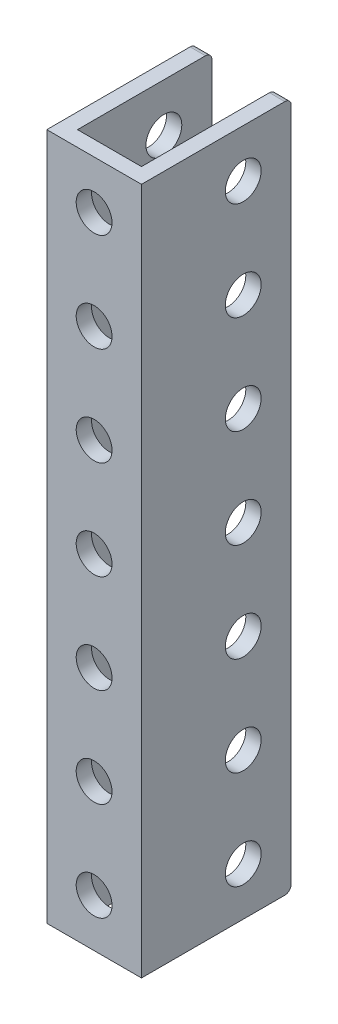
ISO-10303-21;
HEADER;
FILE_DESCRIPTION(('STEP AP214'),'2;1');
FILE_NAME('part.step','',(''),(''),'','','');
FILE_SCHEMA(('AUTOMOTIVE_DESIGN { 1 0 10303 214 1 1 1 1 }'));
ENDSEC;
DATA;
#1=APPLICATION_CONTEXT('core data for automotive mechanical design processes');
#2=APPLICATION_PROTOCOL_DEFINITION('international standard','automotive_design',2000,#1);
#3=PRODUCT_CONTEXT('',#1,'mechanical');
#4=PRODUCT('Part','Part','',(#3));
#5=PRODUCT_RELATED_PRODUCT_CATEGORY('part','',(#4));
#6=PRODUCT_DEFINITION_FORMATION('','',#4);
#7=PRODUCT_DEFINITION_CONTEXT('part definition',#1,'design');
#8=PRODUCT_DEFINITION('design','',#6,#7);
#9=PRODUCT_DEFINITION_SHAPE('','',#8);
#10=(LENGTH_UNIT() NAMED_UNIT(*) SI_UNIT(.MILLI.,.METRE.));
#11=(NAMED_UNIT(*) PLANE_ANGLE_UNIT() SI_UNIT($,.RADIAN.));
#12=(NAMED_UNIT(*) SI_UNIT($,.STERADIAN.) SOLID_ANGLE_UNIT());
#13=UNCERTAINTY_MEASURE_WITH_UNIT(LENGTH_MEASURE(1.E-05),#10,'distance_accuracy_value','');
#14=(GEOMETRIC_REPRESENTATION_CONTEXT(3) GLOBAL_UNCERTAINTY_ASSIGNED_CONTEXT((#13)) GLOBAL_UNIT_ASSIGNED_CONTEXT((#10,
#11,#12)) REPRESENTATION_CONTEXT('',''));
#15=CARTESIAN_POINT('',(0.,0.,0.));
#16=DIRECTION('',(0.,0.,1.));
#17=DIRECTION('',(1.,0.,0.));
#18=AXIS2_PLACEMENT_3D('',#15,#16,#17);
#19=CARTESIAN_POINT('',(4.699,0.,0.));
#20=DIRECTION('',(-1.,0.,0.));
#21=DIRECTION('',(0.,0.,1.));
#22=AXIS2_PLACEMENT_3D('',#19,#20,#21);
#23=PLANE('',#22);
#24=CARTESIAN_POINT('',(4.699,63.4365,-8.5725));
#25=DIRECTION('',(1.,0.,0.));
#26=DIRECTION('',(0.,0.,-1.));
#27=AXIS2_PLACEMENT_3D('',#24,#25,#26);
#28=CIRCLE('',#27,1.77799999999999);
#29=CARTESIAN_POINT('',(4.699,63.4365,-10.3505));
#30=VERTEX_POINT('',#29);
#31=EDGE_CURVE('E260',#30,#30,#28,.T.);
#32=ORIENTED_EDGE('',*,*,#31,.F.);
#33=EDGE_LOOP('',(#32));
#34=FACE_BOUND('',#33,.T.);
#35=CARTESIAN_POINT('',(4.699,34.0995,-8.5725));
#36=DIRECTION('',(1.,0.,0.));
#37=DIRECTION('',(0.,0.,-1.));
#38=AXIS2_PLACEMENT_3D('',#35,#36,#37);
#39=CIRCLE('',#38,1.77799999999998);
#40=CARTESIAN_POINT('',(4.699,34.0995,-10.3505));
#41=VERTEX_POINT('',#40);
#42=EDGE_CURVE('E248',#41,#41,#39,.T.);
#43=ORIENTED_EDGE('',*,*,#42,.F.);
#44=EDGE_LOOP('',(#43));
#45=FACE_BOUND('',#44,.T.);
#46=CARTESIAN_POINT('',(4.699,24.3205,-8.5725));
#47=DIRECTION('',(1.,0.,0.));
#48=DIRECTION('',(0.,0.,-1.));
#49=AXIS2_PLACEMENT_3D('',#46,#47,#48);
#50=CIRCLE('',#49,1.77799999999998);
#51=CARTESIAN_POINT('',(4.699,24.3205,-10.3505));
#52=VERTEX_POINT('',#51);
#53=EDGE_CURVE('E242',#52,#52,#50,.T.);
#54=ORIENTED_EDGE('',*,*,#53,.F.);
#55=EDGE_LOOP('',(#54));
#56=FACE_BOUND('',#55,.T.);
#57=CARTESIAN_POINT('',(4.699,14.5415,-8.5725));
#58=DIRECTION('',(1.,0.,0.));
#59=DIRECTION('',(0.,0.,-1.));
#60=AXIS2_PLACEMENT_3D('',#57,#58,#59);
#61=CIRCLE('',#60,1.77799999999998);
#62=CARTESIAN_POINT('',(4.699,14.5415,-10.3505));
#63=VERTEX_POINT('',#62);
#64=EDGE_CURVE('E236',#63,#63,#61,.T.);
#65=ORIENTED_EDGE('',*,*,#64,.F.);
#66=EDGE_LOOP('',(#65));
#67=FACE_BOUND('',#66,.T.);
#68=CARTESIAN_POINT('',(4.699,4.7625,-8.5725));
#69=DIRECTION('',(1.,0.,0.));
#70=DIRECTION('',(0.,0.,-1.));
#71=AXIS2_PLACEMENT_3D('',#68,#69,#70);
#72=CIRCLE('',#71,1.77799999999998);
#73=CARTESIAN_POINT('',(4.699,4.7625,-10.3505));
#74=VERTEX_POINT('',#73);
#75=EDGE_CURVE('E230',#74,#74,#72,.T.);
#76=ORIENTED_EDGE('',*,*,#75,.F.);
#77=EDGE_LOOP('',(#76));
#78=FACE_BOUND('',#77,.T.);
#79=DIRECTION('',(0.,0.,1.));
#80=VECTOR('',#79,1.);
#81=CARTESIAN_POINT('',(4.69899999999999,0.,-13.335));
#82=LINE('',#81,#80);
#83=CARTESIAN_POINT('',(4.69899999999999,0.,-12.7));
#84=VERTEX_POINT('',#83);
#85=CARTESIAN_POINT('',(4.699,0.,1.524));
#86=VERTEX_POINT('',#85);
#87=EDGE_CURVE('E169',#84,#86,#82,.T.);
#88=ORIENTED_EDGE('',*,*,#87,.F.);
#89=CARTESIAN_POINT('',(4.699,0.634999999999997,-12.7));
#90=DIRECTION('',(-1.,0.,0.));
#91=DIRECTION('',(0.,0.,1.));
#92=AXIS2_PLACEMENT_3D('',#89,#90,#91);
#93=CIRCLE('',#92,0.635);
#94=CARTESIAN_POINT('',(4.69899999999999,0.634999999999997,-13.335));
#95=VERTEX_POINT('',#94);
#96=EDGE_CURVE('E203',#84,#95,#93,.F.);
#97=ORIENTED_EDGE('',*,*,#96,.T.);
#98=DIRECTION('',(0.,-1.,0.));
#99=VECTOR('',#98,1.);
#100=CARTESIAN_POINT('',(4.69899999999999,68.199,-13.335));
#101=LINE('',#100,#99);
#102=CARTESIAN_POINT('',(4.69899999999999,67.564,-13.335));
#103=VERTEX_POINT('',#102);
#104=EDGE_CURVE('E165',#103,#95,#101,.T.);
#105=ORIENTED_EDGE('',*,*,#104,.F.);
#106=CARTESIAN_POINT('',(4.699,67.564,-12.7));
#107=DIRECTION('',(-1.,0.,0.));
#108=DIRECTION('',(0.,0.,1.));
#109=AXIS2_PLACEMENT_3D('',#106,#107,#108);
#110=CIRCLE('',#109,0.635);
#111=CARTESIAN_POINT('',(4.69899999999999,68.199,-12.7));
#112=VERTEX_POINT('',#111);
#113=EDGE_CURVE('E201',#103,#112,#110,.F.);
#114=ORIENTED_EDGE('',*,*,#113,.T.);
#115=DIRECTION('',(0.,0.,-1.));
#116=VECTOR('',#115,1.);
#117=CARTESIAN_POINT('',(4.699,68.199,1.524));
#118=LINE('',#117,#116);
#119=CARTESIAN_POINT('',(4.699,68.199,1.524));
#120=VERTEX_POINT('',#119);
#121=EDGE_CURVE('E163',#120,#112,#118,.T.);
#122=ORIENTED_EDGE('',*,*,#121,.F.);
#123=DIRECTION('',(0.,1.,0.));
#124=VECTOR('',#123,1.);
#125=CARTESIAN_POINT('',(4.699,0.,1.524));
#126=LINE('',#125,#124);
#127=EDGE_CURVE('E171',#86,#120,#126,.T.);
#128=ORIENTED_EDGE('',*,*,#127,.F.);
#129=EDGE_LOOP('',(#88,#97,#105,#114,#122,#128));
#130=FACE_BOUND('',#129,.T.);
#131=CARTESIAN_POINT('',(4.699,43.8785,-8.5725));
#132=DIRECTION('',(1.,0.,0.));
#133=DIRECTION('',(0.,0.,-1.));
#134=AXIS2_PLACEMENT_3D('',#131,#132,#133);
#135=CIRCLE('',#134,1.77799999999998);
#136=CARTESIAN_POINT('',(4.699,43.8785,-10.3505));
#137=VERTEX_POINT('',#136);
#138=EDGE_CURVE('E254',#137,#137,#135,.T.);
#139=ORIENTED_EDGE('',*,*,#138,.F.);
#140=EDGE_LOOP('',(#139));
#141=FACE_BOUND('',#140,.T.);
#142=CARTESIAN_POINT('',(4.699,53.6575,-8.5725));
#143=DIRECTION('',(1.,0.,0.));
#144=DIRECTION('',(0.,0.,-1.));
#145=AXIS2_PLACEMENT_3D('',#142,#143,#144);
#146=CIRCLE('',#145,1.77799999999998);
#147=CARTESIAN_POINT('',(4.699,53.6575,-10.3505));
#148=VERTEX_POINT('',#147);
#149=EDGE_CURVE('E266',#148,#148,#146,.T.);
#150=ORIENTED_EDGE('',*,*,#149,.F.);
#151=EDGE_LOOP('',(#150));
#152=FACE_BOUND('',#151,.T.);
#153=ADVANCED_FACE('F33',(#34,#45,#56,#67,#78,#130,#141,#152),#23,.F.);
#154=CARTESIAN_POINT('',(4.69899999999999,68.199,-13.335));
#155=DIRECTION('',(0.,0.,-1.));
#156=DIRECTION('',(-1.,0.,0.));
#157=AXIS2_PLACEMENT_3D('',#154,#155,#156);
#158=PLANE('',#157);
#159=DIRECTION('',(0.,-1.,0.));
#160=VECTOR('',#159,1.);
#161=CARTESIAN_POINT('',(-4.699,68.199,-13.335));
#162=LINE('',#161,#160);
#163=CARTESIAN_POINT('',(-4.699,67.564,-13.335));
#164=VERTEX_POINT('',#163);
#165=CARTESIAN_POINT('',(-4.699,0.634999999999997,-13.335));
#166=VERTEX_POINT('',#165);
#167=EDGE_CURVE('E177',#164,#166,#162,.T.);
#168=ORIENTED_EDGE('',*,*,#167,.F.);
#169=DIRECTION('',(-1.,0.,0.));
#170=VECTOR('',#169,1.);
#171=CARTESIAN_POINT('',(4.69899999999999,67.564,-13.335));
#172=LINE('',#171,#170);
#173=CARTESIAN_POINT('',(-3.175,67.564,-13.335));
#174=VERTEX_POINT('',#173);
#175=EDGE_CURVE('E54',#164,#174,#172,.F.);
#176=ORIENTED_EDGE('',*,*,#175,.T.);
#177=DIRECTION('',(0.,-1.,0.));
#178=VECTOR('',#177,1.);
#179=CARTESIAN_POINT('',(-3.175,68.199,-13.335));
#180=LINE('',#179,#178);
#181=CARTESIAN_POINT('',(-3.175,0.634999999999997,-13.335));
#182=VERTEX_POINT('',#181);
#183=EDGE_CURVE('E149',#174,#182,#180,.T.);
#184=ORIENTED_EDGE('',*,*,#183,.T.);
#185=DIRECTION('',(-1.,0.,0.));
#186=VECTOR('',#185,1.);
#187=CARTESIAN_POINT('',(4.69899999999999,0.634999999999997,-13.335));
#188=LINE('',#187,#186);
#189=EDGE_CURVE('E213',#182,#166,#188,.T.);
#190=ORIENTED_EDGE('',*,*,#189,.T.);
#191=EDGE_LOOP('',(#168,#176,#184,#190));
#192=FACE_BOUND('',#191,.T.);
#193=ADVANCED_FACE('F217',(#192),#158,.T.);
#194=CARTESIAN_POINT('',(4.699,68.199,1.524));
#195=DIRECTION('',(0.,1.,0.));
#196=DIRECTION('',(0.,0.,1.));
#197=AXIS2_PLACEMENT_3D('',#194,#195,#196);
#198=PLANE('',#197);
#199=ORIENTED_EDGE('',*,*,#121,.T.);
#200=DIRECTION('',(-1.,0.,0.));
#201=VECTOR('',#200,1.);
#202=CARTESIAN_POINT('',(4.69899999999999,68.199,-12.7));
#203=LINE('',#202,#201);
#204=CARTESIAN_POINT('',(3.175,68.199,-12.7));
#205=VERTEX_POINT('',#204);
#206=EDGE_CURVE('E131',#112,#205,#203,.T.);
#207=ORIENTED_EDGE('',*,*,#206,.T.);
#208=DIRECTION('',(0.,0.,1.));
#209=VECTOR('',#208,1.);
#210=CARTESIAN_POINT('',(3.175,68.199,-13.335));
#211=LINE('',#210,#209);
#212=CARTESIAN_POINT('',(3.175,68.199,0.));
#213=VERTEX_POINT('',#212);
#214=EDGE_CURVE('E123',#205,#213,#211,.T.);
#215=ORIENTED_EDGE('',*,*,#214,.T.);
#216=DIRECTION('',(-1.,0.,0.));
#217=VECTOR('',#216,1.);
#218=CARTESIAN_POINT('',(3.175,68.199,0.));
#219=LINE('',#218,#217);
#220=CARTESIAN_POINT('',(-3.175,68.199,0.));
#221=VERTEX_POINT('',#220);
#222=EDGE_CURVE('E129',#213,#221,#219,.T.);
#223=ORIENTED_EDGE('',*,*,#222,.T.);
#224=DIRECTION('',(0.,0.,-1.));
#225=VECTOR('',#224,1.);
#226=CARTESIAN_POINT('',(-3.175,68.199,0.));
#227=LINE('',#226,#225);
#228=CARTESIAN_POINT('',(-3.175,68.199,-12.7));
#229=VERTEX_POINT('',#228);
#230=EDGE_CURVE('E133',#221,#229,#227,.T.);
#231=ORIENTED_EDGE('',*,*,#230,.T.);
#232=DIRECTION('',(-1.,0.,0.));
#233=VECTOR('',#232,1.);
#234=CARTESIAN_POINT('',(4.69899999999999,68.199,-12.7));
#235=LINE('',#234,#233);
#236=CARTESIAN_POINT('',(-4.699,68.199,-12.7));
#237=VERTEX_POINT('',#236);
#238=EDGE_CURVE('E205',#229,#237,#235,.T.);
#239=ORIENTED_EDGE('',*,*,#238,.T.);
#240=DIRECTION('',(0.,0.,-1.));
#241=VECTOR('',#240,1.);
#242=CARTESIAN_POINT('',(-4.699,68.199,1.524));
#243=LINE('',#242,#241);
#244=CARTESIAN_POINT('',(-4.699,68.199,1.524));
#245=VERTEX_POINT('',#244);
#246=EDGE_CURVE('E160',#245,#237,#243,.T.);
#247=ORIENTED_EDGE('',*,*,#246,.F.);
#248=DIRECTION('',(-1.,0.,0.));
#249=VECTOR('',#248,1.);
#250=CARTESIAN_POINT('',(4.699,68.199,1.524));
#251=LINE('',#250,#249);
#252=EDGE_CURVE('E184',#120,#245,#251,.T.);
#253=ORIENTED_EDGE('',*,*,#252,.F.);
#254=EDGE_LOOP('',(#199,#207,#215,#223,#231,#239,#247,#253));
#255=FACE_BOUND('',#254,.T.);
#256=ADVANCED_FACE('F126',(#255),#198,.T.);
#257=CARTESIAN_POINT('',(4.699,0.,1.524));
#258=DIRECTION('',(0.,0.,1.));
#259=DIRECTION('',(1.,0.,0.));
#260=AXIS2_PLACEMENT_3D('',#257,#258,#259);
#261=PLANE('',#260);
#262=CARTESIAN_POINT('',(0.,53.6575,1.524));
#263=DIRECTION('',(0.,0.,1.));
#264=DIRECTION('',(1.,0.,0.));
#265=AXIS2_PLACEMENT_3D('',#262,#263,#264);
#266=CIRCLE('',#265,1.77799999999998);
#267=CARTESIAN_POINT('',(1.77799999999998,53.6575,1.524));
#268=VERTEX_POINT('',#267);
#269=EDGE_CURVE('E308',#268,#268,#266,.T.);
#270=ORIENTED_EDGE('',*,*,#269,.F.);
#271=EDGE_LOOP('',(#270));
#272=FACE_BOUND('',#271,.T.);
#273=CARTESIAN_POINT('',(0.,63.4365,1.524));
#274=DIRECTION('',(0.,0.,1.));
#275=DIRECTION('',(1.,0.,0.));
#276=AXIS2_PLACEMENT_3D('',#273,#274,#275);
#277=CIRCLE('',#276,1.77799999999998);
#278=CARTESIAN_POINT('',(1.77799999999998,63.4365,1.524));
#279=VERTEX_POINT('',#278);
#280=EDGE_CURVE('E302',#279,#279,#277,.T.);
#281=ORIENTED_EDGE('',*,*,#280,.F.);
#282=EDGE_LOOP('',(#281));
#283=FACE_BOUND('',#282,.T.);
#284=CARTESIAN_POINT('',(0.,43.8785,1.524));
#285=DIRECTION('',(0.,0.,1.));
#286=DIRECTION('',(1.,0.,0.));
#287=AXIS2_PLACEMENT_3D('',#284,#285,#286);
#288=CIRCLE('',#287,1.77799999999998);
#289=CARTESIAN_POINT('',(1.77799999999998,43.8785,1.524));
#290=VERTEX_POINT('',#289);
#291=EDGE_CURVE('E296',#290,#290,#288,.T.);
#292=ORIENTED_EDGE('',*,*,#291,.F.);
#293=EDGE_LOOP('',(#292));
#294=FACE_BOUND('',#293,.T.);
#295=CARTESIAN_POINT('',(0.,34.0995,1.524));
#296=DIRECTION('',(0.,0.,1.));
#297=DIRECTION('',(1.,0.,0.));
#298=AXIS2_PLACEMENT_3D('',#295,#296,#297);
#299=CIRCLE('',#298,1.77799999999998);
#300=CARTESIAN_POINT('',(1.77799999999998,34.0995,1.524));
#301=VERTEX_POINT('',#300);
#302=EDGE_CURVE('E290',#301,#301,#299,.T.);
#303=ORIENTED_EDGE('',*,*,#302,.F.);
#304=EDGE_LOOP('',(#303));
#305=FACE_BOUND('',#304,.T.);
#306=CARTESIAN_POINT('',(0.,24.3205,1.524));
#307=DIRECTION('',(0.,0.,1.));
#308=DIRECTION('',(1.,0.,0.));
#309=AXIS2_PLACEMENT_3D('',#306,#307,#308);
#310=CIRCLE('',#309,1.77799999999998);
#311=CARTESIAN_POINT('',(1.77799999999998,24.3205,1.524));
#312=VERTEX_POINT('',#311);
#313=EDGE_CURVE('E284',#312,#312,#310,.T.);
#314=ORIENTED_EDGE('',*,*,#313,.F.);
#315=EDGE_LOOP('',(#314));
#316=FACE_BOUND('',#315,.T.);
#317=CARTESIAN_POINT('',(0.,14.5415,1.524));
#318=DIRECTION('',(0.,0.,1.));
#319=DIRECTION('',(1.,0.,0.));
#320=AXIS2_PLACEMENT_3D('',#317,#318,#319);
#321=CIRCLE('',#320,1.77799999999998);
#322=CARTESIAN_POINT('',(1.77799999999998,14.5415,1.524));
#323=VERTEX_POINT('',#322);
#324=EDGE_CURVE('E278',#323,#323,#321,.T.);
#325=ORIENTED_EDGE('',*,*,#324,.F.);
#326=EDGE_LOOP('',(#325));
#327=FACE_BOUND('',#326,.T.);
#328=CARTESIAN_POINT('',(0.,4.7625,1.524));
#329=DIRECTION('',(0.,0.,1.));
#330=DIRECTION('',(1.,0.,0.));
#331=AXIS2_PLACEMENT_3D('',#328,#329,#330);
#332=CIRCLE('',#331,1.77799999999998);
#333=CARTESIAN_POINT('',(1.77799999999998,4.7625,1.524));
#334=VERTEX_POINT('',#333);
#335=EDGE_CURVE('E272',#334,#334,#332,.T.);
#336=ORIENTED_EDGE('',*,*,#335,.F.);
#337=EDGE_LOOP('',(#336));
#338=FACE_BOUND('',#337,.T.);
#339=DIRECTION('',(0.,1.,0.));
#340=VECTOR('',#339,1.);
#341=CARTESIAN_POINT('',(-4.699,0.,1.524));
#342=LINE('',#341,#340);
#343=CARTESIAN_POINT('',(-4.699,0.,1.524));
#344=VERTEX_POINT('',#343);
#345=EDGE_CURVE('E166',#344,#245,#342,.T.);
#346=ORIENTED_EDGE('',*,*,#345,.F.);
#347=DIRECTION('',(-1.,0.,0.));
#348=VECTOR('',#347,1.);
#349=CARTESIAN_POINT('',(4.699,0.,1.524));
#350=LINE('',#349,#348);
#351=EDGE_CURVE('E174',#86,#344,#350,.T.);
#352=ORIENTED_EDGE('',*,*,#351,.F.);
#353=ORIENTED_EDGE('',*,*,#127,.T.);
#354=ORIENTED_EDGE('',*,*,#252,.T.);
#355=EDGE_LOOP('',(#346,#352,#353,#354));
#356=FACE_BOUND('',#355,.T.);
#357=ADVANCED_FACE('F404',(#272,#283,#294,#305,#316,#327,#338,#356),#261,.T.);
#358=CARTESIAN_POINT('',(4.69899999999999,0.,-13.335));
#359=DIRECTION('',(0.,-1.,0.));
#360=DIRECTION('',(0.,0.,-1.));
#361=AXIS2_PLACEMENT_3D('',#358,#359,#360);
#362=PLANE('',#361);
#363=DIRECTION('',(0.,0.,1.));
#364=VECTOR('',#363,1.);
#365=CARTESIAN_POINT('',(3.175,0.,-13.335));
#366=LINE('',#365,#364);
#367=CARTESIAN_POINT('',(3.175,0.,-12.7));
#368=VERTEX_POINT('',#367);
#369=CARTESIAN_POINT('',(3.175,0.,0.));
#370=VERTEX_POINT('',#369);
#371=EDGE_CURVE('E140',#368,#370,#366,.T.);
#372=ORIENTED_EDGE('',*,*,#371,.F.);
#373=DIRECTION('',(-1.,0.,0.));
#374=VECTOR('',#373,1.);
#375=CARTESIAN_POINT('',(4.69899999999999,0.,-12.7));
#376=LINE('',#375,#374);
#377=EDGE_CURVE('E199',#368,#84,#376,.F.);
#378=ORIENTED_EDGE('',*,*,#377,.T.);
#379=ORIENTED_EDGE('',*,*,#87,.T.);
#380=ORIENTED_EDGE('',*,*,#351,.T.);
#381=DIRECTION('',(0.,0.,1.));
#382=VECTOR('',#381,1.);
#383=CARTESIAN_POINT('',(-4.699,0.,-13.335));
#384=LINE('',#383,#382);
#385=CARTESIAN_POINT('',(-4.699,0.,-12.7));
#386=VERTEX_POINT('',#385);
#387=EDGE_CURVE('E180',#386,#344,#384,.T.);
#388=ORIENTED_EDGE('',*,*,#387,.F.);
#389=DIRECTION('',(-1.,0.,0.));
#390=VECTOR('',#389,1.);
#391=CARTESIAN_POINT('',(4.69899999999999,0.,-12.7));
#392=LINE('',#391,#390);
#393=CARTESIAN_POINT('',(-3.175,0.,-12.7));
#394=VERTEX_POINT('',#393);
#395=EDGE_CURVE('E197',#386,#394,#392,.F.);
#396=ORIENTED_EDGE('',*,*,#395,.T.);
#397=DIRECTION('',(0.,0.,-1.));
#398=VECTOR('',#397,1.);
#399=CARTESIAN_POINT('',(-3.175,0.,0.));
#400=LINE('',#399,#398);
#401=CARTESIAN_POINT('',(-3.175,0.,0.));
#402=VERTEX_POINT('',#401);
#403=EDGE_CURVE('E154',#402,#394,#400,.T.);
#404=ORIENTED_EDGE('',*,*,#403,.F.);
#405=DIRECTION('',(-1.,0.,0.));
#406=VECTOR('',#405,1.);
#407=CARTESIAN_POINT('',(3.175,0.,0.));
#408=LINE('',#407,#406);
#409=EDGE_CURVE('E158',#370,#402,#408,.T.);
#410=ORIENTED_EDGE('',*,*,#409,.F.);
#411=EDGE_LOOP('',(#372,#378,#379,#380,#388,#396,#404,#410));
#412=FACE_BOUND('',#411,.T.);
#413=ADVANCED_FACE('F407',(#412),#362,.T.);
#414=ORIENTED_EDGE('',*,*,#104,.T.);
#415=DIRECTION('',(-1.,0.,0.));
#416=VECTOR('',#415,1.);
#417=CARTESIAN_POINT('',(4.69899999999999,0.634999999999997,-13.335));
#418=LINE('',#417,#416);
#419=CARTESIAN_POINT('',(3.175,0.634999999999997,-13.335));
#420=VERTEX_POINT('',#419);
#421=EDGE_CURVE('E190',#95,#420,#418,.T.);
#422=ORIENTED_EDGE('',*,*,#421,.T.);
#423=DIRECTION('',(0.,-1.,0.));
#424=VECTOR('',#423,1.);
#425=CARTESIAN_POINT('',(3.175,68.199,-13.335));
#426=LINE('',#425,#424);
#427=CARTESIAN_POINT('',(3.175,67.564,-13.335));
#428=VERTEX_POINT('',#427);
#429=EDGE_CURVE('E145',#428,#420,#426,.T.);
#430=ORIENTED_EDGE('',*,*,#429,.F.);
#431=DIRECTION('',(-1.,0.,0.));
#432=VECTOR('',#431,1.);
#433=CARTESIAN_POINT('',(4.69899999999999,67.564,-13.335));
#434=LINE('',#433,#432);
#435=EDGE_CURVE('E186',#428,#103,#434,.F.);
#436=ORIENTED_EDGE('',*,*,#435,.T.);
#437=EDGE_LOOP('',(#414,#422,#430,#436));
#438=FACE_BOUND('',#437,.T.);
#439=ADVANCED_FACE('F396',(#438),#158,.T.);
#440=CARTESIAN_POINT('',(-4.699,0.,0.));
#441=DIRECTION('',(-1.,0.,0.));
#442=DIRECTION('',(0.,0.,1.));
#443=AXIS2_PLACEMENT_3D('',#440,#441,#442);
#444=PLANE('',#443);
#445=CARTESIAN_POINT('',(-4.69900000000001,53.6575,-8.5725));
#446=DIRECTION('',(1.,0.,0.));
#447=DIRECTION('',(0.,0.,-1.));
#448=AXIS2_PLACEMENT_3D('',#445,#446,#447);
#449=CIRCLE('',#448,1.77799999999998);
#450=CARTESIAN_POINT('',(-4.69900000000001,53.6575,-10.3505));
#451=VERTEX_POINT('',#450);
#452=EDGE_CURVE('E347',#451,#451,#449,.T.);
#453=ORIENTED_EDGE('',*,*,#452,.T.);
#454=EDGE_LOOP('',(#453));
#455=FACE_BOUND('',#454,.T.);
#456=CARTESIAN_POINT('',(-4.69900000000001,63.4365,-8.5725));
#457=DIRECTION('',(1.,0.,0.));
#458=DIRECTION('',(0.,0.,-1.));
#459=AXIS2_PLACEMENT_3D('',#456,#457,#458);
#460=CIRCLE('',#459,1.77799999999999);
#461=CARTESIAN_POINT('',(-4.69900000000001,63.4365,-10.3505));
#462=VERTEX_POINT('',#461);
#463=EDGE_CURVE('E341',#462,#462,#460,.T.);
#464=ORIENTED_EDGE('',*,*,#463,.T.);
#465=EDGE_LOOP('',(#464));
#466=FACE_BOUND('',#465,.T.);
#467=CARTESIAN_POINT('',(-4.69900000000001,43.8785,-8.5725));
#468=DIRECTION('',(1.,0.,0.));
#469=DIRECTION('',(0.,0.,-1.));
#470=AXIS2_PLACEMENT_3D('',#467,#468,#469);
#471=CIRCLE('',#470,1.77799999999998);
#472=CARTESIAN_POINT('',(-4.69900000000001,43.8785,-10.3505));
#473=VERTEX_POINT('',#472);
#474=EDGE_CURVE('E335',#473,#473,#471,.T.);
#475=ORIENTED_EDGE('',*,*,#474,.T.);
#476=EDGE_LOOP('',(#475));
#477=FACE_BOUND('',#476,.T.);
#478=CARTESIAN_POINT('',(-4.69900000000001,34.0995,-8.5725));
#479=DIRECTION('',(1.,0.,0.));
#480=DIRECTION('',(0.,0.,-1.));
#481=AXIS2_PLACEMENT_3D('',#478,#479,#480);
#482=CIRCLE('',#481,1.77799999999998);
#483=CARTESIAN_POINT('',(-4.69900000000001,34.0995,-10.3505));
#484=VERTEX_POINT('',#483);
#485=EDGE_CURVE('E329',#484,#484,#482,.T.);
#486=ORIENTED_EDGE('',*,*,#485,.T.);
#487=EDGE_LOOP('',(#486));
#488=FACE_BOUND('',#487,.T.);
#489=CARTESIAN_POINT('',(-4.69900000000001,24.3205,-8.5725));
#490=DIRECTION('',(1.,0.,0.));
#491=DIRECTION('',(0.,0.,-1.));
#492=AXIS2_PLACEMENT_3D('',#489,#490,#491);
#493=CIRCLE('',#492,1.77799999999998);
#494=CARTESIAN_POINT('',(-4.69900000000001,24.3205,-10.3505));
#495=VERTEX_POINT('',#494);
#496=EDGE_CURVE('E323',#495,#495,#493,.T.);
#497=ORIENTED_EDGE('',*,*,#496,.T.);
#498=EDGE_LOOP('',(#497));
#499=FACE_BOUND('',#498,.T.);
#500=CARTESIAN_POINT('',(-4.69900000000001,14.5415,-8.5725));
#501=DIRECTION('',(1.,0.,0.));
#502=DIRECTION('',(0.,0.,-1.));
#503=AXIS2_PLACEMENT_3D('',#500,#501,#502);
#504=CIRCLE('',#503,1.77799999999998);
#505=CARTESIAN_POINT('',(-4.69900000000001,14.5415,-10.3505));
#506=VERTEX_POINT('',#505);
#507=EDGE_CURVE('E317',#506,#506,#504,.T.);
#508=ORIENTED_EDGE('',*,*,#507,.T.);
#509=EDGE_LOOP('',(#508));
#510=FACE_BOUND('',#509,.T.);
#511=CARTESIAN_POINT('',(-4.69900000000001,4.7625,-8.5725));
#512=DIRECTION('',(1.,0.,0.));
#513=DIRECTION('',(0.,0.,-1.));
#514=AXIS2_PLACEMENT_3D('',#511,#512,#513);
#515=CIRCLE('',#514,1.77799999999998);
#516=CARTESIAN_POINT('',(-4.69900000000001,4.7625,-10.3505));
#517=VERTEX_POINT('',#516);
#518=EDGE_CURVE('E311',#517,#517,#515,.T.);
#519=ORIENTED_EDGE('',*,*,#518,.T.);
#520=EDGE_LOOP('',(#519));
#521=FACE_BOUND('',#520,.T.);
#522=ORIENTED_EDGE('',*,*,#246,.T.);
#523=CARTESIAN_POINT('',(-4.699,67.564,-12.7));
#524=DIRECTION('',(-1.,0.,0.));
#525=DIRECTION('',(0.,0.,1.));
#526=AXIS2_PLACEMENT_3D('',#523,#524,#525);
#527=CIRCLE('',#526,0.635);
#528=EDGE_CURVE('E211',#237,#164,#527,.T.);
#529=ORIENTED_EDGE('',*,*,#528,.T.);
#530=ORIENTED_EDGE('',*,*,#167,.T.);
#531=CARTESIAN_POINT('',(-4.699,0.634999999999997,-12.7));
#532=DIRECTION('',(-1.,0.,0.));
#533=DIRECTION('',(0.,0.,1.));
#534=AXIS2_PLACEMENT_3D('',#531,#532,#533);
#535=CIRCLE('',#534,0.635);
#536=EDGE_CURVE('E209',#166,#386,#535,.T.);
#537=ORIENTED_EDGE('',*,*,#536,.T.);
#538=ORIENTED_EDGE('',*,*,#387,.T.);
#539=ORIENTED_EDGE('',*,*,#345,.T.);
#540=EDGE_LOOP('',(#522,#529,#530,#537,#538,#539));
#541=FACE_BOUND('',#540,.T.);
#542=ADVANCED_FACE('F220',(#455,#466,#477,#488,#499,#510,#521,#541),#444,.T.);
#543=CARTESIAN_POINT('',(-3.175,68.199,0.));
#544=DIRECTION('',(-1.,0.,0.));
#545=DIRECTION('',(0.,0.,1.));
#546=AXIS2_PLACEMENT_3D('',#543,#544,#545);
#547=PLANE('',#546);
#548=CARTESIAN_POINT('',(-3.175,53.6575,-8.5725));
#549=DIRECTION('',(1.,0.,0.));
#550=DIRECTION('',(0.,0.,-1.));
#551=AXIS2_PLACEMENT_3D('',#548,#549,#550);
#552=CIRCLE('',#551,1.77799999999998);
#553=CARTESIAN_POINT('',(-3.175,53.6575,-10.3505));
#554=VERTEX_POINT('',#553);
#555=EDGE_CURVE('E350',#554,#554,#552,.T.);
#556=ORIENTED_EDGE('',*,*,#555,.F.);
#557=EDGE_LOOP('',(#556));
#558=FACE_BOUND('',#557,.T.);
#559=CARTESIAN_POINT('',(-3.175,63.4365,-8.5725));
#560=DIRECTION('',(1.,0.,0.));
#561=DIRECTION('',(0.,0.,-1.));
#562=AXIS2_PLACEMENT_3D('',#559,#560,#561);
#563=CIRCLE('',#562,1.77799999999999);
#564=CARTESIAN_POINT('',(-3.175,63.4365,-10.3505));
#565=VERTEX_POINT('',#564);
#566=EDGE_CURVE('E344',#565,#565,#563,.T.);
#567=ORIENTED_EDGE('',*,*,#566,.F.);
#568=EDGE_LOOP('',(#567));
#569=FACE_BOUND('',#568,.T.);
#570=CARTESIAN_POINT('',(-3.175,43.8785,-8.5725));
#571=DIRECTION('',(1.,0.,0.));
#572=DIRECTION('',(0.,0.,-1.));
#573=AXIS2_PLACEMENT_3D('',#570,#571,#572);
#574=CIRCLE('',#573,1.77799999999998);
#575=CARTESIAN_POINT('',(-3.175,43.8785,-10.3505));
#576=VERTEX_POINT('',#575);
#577=EDGE_CURVE('E338',#576,#576,#574,.T.);
#578=ORIENTED_EDGE('',*,*,#577,.F.);
#579=EDGE_LOOP('',(#578));
#580=FACE_BOUND('',#579,.T.);
#581=CARTESIAN_POINT('',(-3.175,34.0995,-8.5725));
#582=DIRECTION('',(1.,0.,0.));
#583=DIRECTION('',(0.,0.,-1.));
#584=AXIS2_PLACEMENT_3D('',#581,#582,#583);
#585=CIRCLE('',#584,1.77799999999998);
#586=CARTESIAN_POINT('',(-3.175,34.0995,-10.3505));
#587=VERTEX_POINT('',#586);
#588=EDGE_CURVE('E332',#587,#587,#585,.T.);
#589=ORIENTED_EDGE('',*,*,#588,.F.);
#590=EDGE_LOOP('',(#589));
#591=FACE_BOUND('',#590,.T.);
#592=CARTESIAN_POINT('',(-3.175,24.3205,-8.5725));
#593=DIRECTION('',(1.,0.,0.));
#594=DIRECTION('',(0.,0.,-1.));
#595=AXIS2_PLACEMENT_3D('',#592,#593,#594);
#596=CIRCLE('',#595,1.77799999999998);
#597=CARTESIAN_POINT('',(-3.175,24.3205,-10.3505));
#598=VERTEX_POINT('',#597);
#599=EDGE_CURVE('E326',#598,#598,#596,.T.);
#600=ORIENTED_EDGE('',*,*,#599,.F.);
#601=EDGE_LOOP('',(#600));
#602=FACE_BOUND('',#601,.T.);
#603=CARTESIAN_POINT('',(-3.175,14.5415,-8.5725));
#604=DIRECTION('',(1.,0.,0.));
#605=DIRECTION('',(0.,0.,-1.));
#606=AXIS2_PLACEMENT_3D('',#603,#604,#605);
#607=CIRCLE('',#606,1.77799999999998);
#608=CARTESIAN_POINT('',(-3.175,14.5415,-10.3505));
#609=VERTEX_POINT('',#608);
#610=EDGE_CURVE('E320',#609,#609,#607,.T.);
#611=ORIENTED_EDGE('',*,*,#610,.F.);
#612=EDGE_LOOP('',(#611));
#613=FACE_BOUND('',#612,.T.);
#614=CARTESIAN_POINT('',(-3.175,4.7625,-8.5725));
#615=DIRECTION('',(1.,0.,0.));
#616=DIRECTION('',(0.,0.,-1.));
#617=AXIS2_PLACEMENT_3D('',#614,#615,#616);
#618=CIRCLE('',#617,1.77799999999998);
#619=CARTESIAN_POINT('',(-3.175,4.7625,-10.3505));
#620=VERTEX_POINT('',#619);
#621=EDGE_CURVE('E314',#620,#620,#618,.T.);
#622=ORIENTED_EDGE('',*,*,#621,.F.);
#623=EDGE_LOOP('',(#622));
#624=FACE_BOUND('',#623,.T.);
#625=ORIENTED_EDGE('',*,*,#183,.F.);
#626=CARTESIAN_POINT('',(-3.175,67.564,-12.7));
#627=DIRECTION('',(-1.,0.,0.));
#628=DIRECTION('',(0.,0.,1.));
#629=AXIS2_PLACEMENT_3D('',#626,#627,#628);
#630=CIRCLE('',#629,0.635);
#631=EDGE_CURVE('E11',#174,#229,#630,.F.);
#632=ORIENTED_EDGE('',*,*,#631,.T.);
#633=ORIENTED_EDGE('',*,*,#230,.F.);
#634=DIRECTION('',(0.,-1.,0.));
#635=VECTOR('',#634,1.);
#636=CARTESIAN_POINT('',(-3.175,68.199,0.));
#637=LINE('',#636,#635);
#638=EDGE_CURVE('E144',#221,#402,#637,.T.);
#639=ORIENTED_EDGE('',*,*,#638,.T.);
#640=ORIENTED_EDGE('',*,*,#403,.T.);
#641=CARTESIAN_POINT('',(-3.175,0.634999999999997,-12.7));
#642=DIRECTION('',(-1.,0.,0.));
#643=DIRECTION('',(0.,0.,1.));
#644=AXIS2_PLACEMENT_3D('',#641,#642,#643);
#645=CIRCLE('',#644,0.635);
#646=EDGE_CURVE('E41',#394,#182,#645,.F.);
#647=ORIENTED_EDGE('',*,*,#646,.T.);
#648=EDGE_LOOP('',(#625,#632,#633,#639,#640,#647));
#649=FACE_BOUND('',#648,.T.);
#650=ADVANCED_FACE('F356',(#558,#569,#580,#591,#602,#613,#624,#649),#547,.F.);
#651=CARTESIAN_POINT('',(3.175,68.199,0.));
#652=DIRECTION('',(0.,0.,1.));
#653=DIRECTION('',(1.,0.,0.));
#654=AXIS2_PLACEMENT_3D('',#651,#652,#653);
#655=PLANE('',#654);
#656=CARTESIAN_POINT('',(0.,53.6575,0.));
#657=DIRECTION('',(0.,0.,1.));
#658=DIRECTION('',(1.,0.,0.));
#659=AXIS2_PLACEMENT_3D('',#656,#657,#658);
#660=CIRCLE('',#659,1.77799999999998);
#661=CARTESIAN_POINT('',(1.77799999999998,53.6575,0.));
#662=VERTEX_POINT('',#661);
#663=EDGE_CURVE('E305',#662,#662,#660,.T.);
#664=ORIENTED_EDGE('',*,*,#663,.T.);
#665=EDGE_LOOP('',(#664));
#666=FACE_BOUND('',#665,.T.);
#667=CARTESIAN_POINT('',(0.,63.4365,0.));
#668=DIRECTION('',(0.,0.,1.));
#669=DIRECTION('',(1.,0.,0.));
#670=AXIS2_PLACEMENT_3D('',#667,#668,#669);
#671=CIRCLE('',#670,1.77799999999998);
#672=CARTESIAN_POINT('',(1.77799999999998,63.4365,0.));
#673=VERTEX_POINT('',#672);
#674=EDGE_CURVE('E299',#673,#673,#671,.T.);
#675=ORIENTED_EDGE('',*,*,#674,.T.);
#676=EDGE_LOOP('',(#675));
#677=FACE_BOUND('',#676,.T.);
#678=CARTESIAN_POINT('',(0.,43.8785,0.));
#679=DIRECTION('',(0.,0.,1.));
#680=DIRECTION('',(1.,0.,0.));
#681=AXIS2_PLACEMENT_3D('',#678,#679,#680);
#682=CIRCLE('',#681,1.77799999999998);
#683=CARTESIAN_POINT('',(1.77799999999998,43.8785,0.));
#684=VERTEX_POINT('',#683);
#685=EDGE_CURVE('E293',#684,#684,#682,.T.);
#686=ORIENTED_EDGE('',*,*,#685,.T.);
#687=EDGE_LOOP('',(#686));
#688=FACE_BOUND('',#687,.T.);
#689=CARTESIAN_POINT('',(0.,34.0995,0.));
#690=DIRECTION('',(0.,0.,1.));
#691=DIRECTION('',(1.,0.,0.));
#692=AXIS2_PLACEMENT_3D('',#689,#690,#691);
#693=CIRCLE('',#692,1.77799999999998);
#694=CARTESIAN_POINT('',(1.77799999999998,34.0995,0.));
#695=VERTEX_POINT('',#694);
#696=EDGE_CURVE('E287',#695,#695,#693,.T.);
#697=ORIENTED_EDGE('',*,*,#696,.T.);
#698=EDGE_LOOP('',(#697));
#699=FACE_BOUND('',#698,.T.);
#700=CARTESIAN_POINT('',(0.,24.3205,0.));
#701=DIRECTION('',(0.,0.,1.));
#702=DIRECTION('',(1.,0.,0.));
#703=AXIS2_PLACEMENT_3D('',#700,#701,#702);
#704=CIRCLE('',#703,1.77799999999998);
#705=CARTESIAN_POINT('',(1.77799999999998,24.3205,0.));
#706=VERTEX_POINT('',#705);
#707=EDGE_CURVE('E281',#706,#706,#704,.T.);
#708=ORIENTED_EDGE('',*,*,#707,.T.);
#709=EDGE_LOOP('',(#708));
#710=FACE_BOUND('',#709,.T.);
#711=CARTESIAN_POINT('',(0.,14.5415,0.));
#712=DIRECTION('',(0.,0.,1.));
#713=DIRECTION('',(1.,0.,0.));
#714=AXIS2_PLACEMENT_3D('',#711,#712,#713);
#715=CIRCLE('',#714,1.77799999999998);
#716=CARTESIAN_POINT('',(1.77799999999998,14.5415,0.));
#717=VERTEX_POINT('',#716);
#718=EDGE_CURVE('E275',#717,#717,#715,.T.);
#719=ORIENTED_EDGE('',*,*,#718,.T.);
#720=EDGE_LOOP('',(#719));
#721=FACE_BOUND('',#720,.T.);
#722=CARTESIAN_POINT('',(0.,4.7625,0.));
#723=DIRECTION('',(0.,0.,1.));
#724=DIRECTION('',(1.,0.,0.));
#725=AXIS2_PLACEMENT_3D('',#722,#723,#724);
#726=CIRCLE('',#725,1.77799999999998);
#727=CARTESIAN_POINT('',(1.77799999999998,4.7625,0.));
#728=VERTEX_POINT('',#727);
#729=EDGE_CURVE('E269',#728,#728,#726,.T.);
#730=ORIENTED_EDGE('',*,*,#729,.T.);
#731=EDGE_LOOP('',(#730));
#732=FACE_BOUND('',#731,.T.);
#733=ORIENTED_EDGE('',*,*,#409,.T.);
#734=ORIENTED_EDGE('',*,*,#638,.F.);
#735=ORIENTED_EDGE('',*,*,#222,.F.);
#736=DIRECTION('',(0.,-1.,0.));
#737=VECTOR('',#736,1.);
#738=CARTESIAN_POINT('',(3.175,68.199,0.));
#739=LINE('',#738,#737);
#740=EDGE_CURVE('E136',#213,#370,#739,.T.);
#741=ORIENTED_EDGE('',*,*,#740,.T.);
#742=EDGE_LOOP('',(#733,#734,#735,#741));
#743=FACE_BOUND('',#742,.T.);
#744=ADVANCED_FACE('F147',(#666,#677,#688,#699,#710,#721,#732,#743),#655,.F.);
#745=CARTESIAN_POINT('',(3.175,68.199,-13.335));
#746=DIRECTION('',(1.,0.,0.));
#747=DIRECTION('',(0.,0.,-1.));
#748=AXIS2_PLACEMENT_3D('',#745,#746,#747);
#749=PLANE('',#748);
#750=CARTESIAN_POINT('',(3.175,53.6575,-8.5725));
#751=DIRECTION('',(1.,0.,0.));
#752=DIRECTION('',(0.,0.,-1.));
#753=AXIS2_PLACEMENT_3D('',#750,#751,#752);
#754=CIRCLE('',#753,1.77799999999999);
#755=CARTESIAN_POINT('',(3.175,53.6575,-10.3505));
#756=VERTEX_POINT('',#755);
#757=EDGE_CURVE('E263',#756,#756,#754,.T.);
#758=ORIENTED_EDGE('',*,*,#757,.T.);
#759=EDGE_LOOP('',(#758));
#760=FACE_BOUND('',#759,.T.);
#761=CARTESIAN_POINT('',(3.175,63.4365,-8.5725));
#762=DIRECTION('',(1.,0.,0.));
#763=DIRECTION('',(0.,0.,-1.));
#764=AXIS2_PLACEMENT_3D('',#761,#762,#763);
#765=CIRCLE('',#764,1.77799999999999);
#766=CARTESIAN_POINT('',(3.175,63.4365,-10.3505));
#767=VERTEX_POINT('',#766);
#768=EDGE_CURVE('E257',#767,#767,#765,.T.);
#769=ORIENTED_EDGE('',*,*,#768,.T.);
#770=EDGE_LOOP('',(#769));
#771=FACE_BOUND('',#770,.T.);
#772=CARTESIAN_POINT('',(3.175,43.8785,-8.5725));
#773=DIRECTION('',(1.,0.,0.));
#774=DIRECTION('',(0.,0.,-1.));
#775=AXIS2_PLACEMENT_3D('',#772,#773,#774);
#776=CIRCLE('',#775,1.77799999999999);
#777=CARTESIAN_POINT('',(3.175,43.8785,-10.3505));
#778=VERTEX_POINT('',#777);
#779=EDGE_CURVE('E251',#778,#778,#776,.T.);
#780=ORIENTED_EDGE('',*,*,#779,.T.);
#781=EDGE_LOOP('',(#780));
#782=FACE_BOUND('',#781,.T.);
#783=CARTESIAN_POINT('',(3.175,34.0995,-8.5725));
#784=DIRECTION('',(1.,0.,0.));
#785=DIRECTION('',(0.,0.,-1.));
#786=AXIS2_PLACEMENT_3D('',#783,#784,#785);
#787=CIRCLE('',#786,1.77799999999999);
#788=CARTESIAN_POINT('',(3.175,34.0995,-10.3505));
#789=VERTEX_POINT('',#788);
#790=EDGE_CURVE('E245',#789,#789,#787,.T.);
#791=ORIENTED_EDGE('',*,*,#790,.T.);
#792=EDGE_LOOP('',(#791));
#793=FACE_BOUND('',#792,.T.);
#794=CARTESIAN_POINT('',(3.175,24.3205,-8.5725));
#795=DIRECTION('',(1.,0.,0.));
#796=DIRECTION('',(0.,0.,-1.));
#797=AXIS2_PLACEMENT_3D('',#794,#795,#796);
#798=CIRCLE('',#797,1.77799999999999);
#799=CARTESIAN_POINT('',(3.175,24.3205,-10.3505));
#800=VERTEX_POINT('',#799);
#801=EDGE_CURVE('E239',#800,#800,#798,.T.);
#802=ORIENTED_EDGE('',*,*,#801,.T.);
#803=EDGE_LOOP('',(#802));
#804=FACE_BOUND('',#803,.T.);
#805=CARTESIAN_POINT('',(3.175,14.5415,-8.5725));
#806=DIRECTION('',(1.,0.,0.));
#807=DIRECTION('',(0.,0.,-1.));
#808=AXIS2_PLACEMENT_3D('',#805,#806,#807);
#809=CIRCLE('',#808,1.77799999999999);
#810=CARTESIAN_POINT('',(3.175,14.5415,-10.3505));
#811=VERTEX_POINT('',#810);
#812=EDGE_CURVE('E233',#811,#811,#809,.T.);
#813=ORIENTED_EDGE('',*,*,#812,.T.);
#814=EDGE_LOOP('',(#813));
#815=FACE_BOUND('',#814,.T.);
#816=CARTESIAN_POINT('',(3.175,4.7625,-8.5725));
#817=DIRECTION('',(1.,0.,0.));
#818=DIRECTION('',(0.,0.,-1.));
#819=AXIS2_PLACEMENT_3D('',#816,#817,#818);
#820=CIRCLE('',#819,1.77799999999999);
#821=CARTESIAN_POINT('',(3.175,4.7625,-10.3505));
#822=VERTEX_POINT('',#821);
#823=EDGE_CURVE('E156',#822,#822,#820,.T.);
#824=ORIENTED_EDGE('',*,*,#823,.T.);
#825=EDGE_LOOP('',(#824));
#826=FACE_BOUND('',#825,.T.);
#827=ORIENTED_EDGE('',*,*,#429,.T.);
#828=CARTESIAN_POINT('',(3.175,0.634999999999997,-12.7));
#829=DIRECTION('',(1.,0.,0.));
#830=DIRECTION('',(0.,0.,-1.));
#831=AXIS2_PLACEMENT_3D('',#828,#829,#830);
#832=CIRCLE('',#831,0.635);
#833=EDGE_CURVE('E195',#420,#368,#832,.F.);
#834=ORIENTED_EDGE('',*,*,#833,.T.);
#835=ORIENTED_EDGE('',*,*,#371,.T.);
#836=ORIENTED_EDGE('',*,*,#740,.F.);
#837=ORIENTED_EDGE('',*,*,#214,.F.);
#838=CARTESIAN_POINT('',(3.175,67.564,-12.7));
#839=DIRECTION('',(1.,0.,0.));
#840=DIRECTION('',(0.,0.,-1.));
#841=AXIS2_PLACEMENT_3D('',#838,#839,#840);
#842=CIRCLE('',#841,0.635);
#843=EDGE_CURVE('E193',#205,#428,#842,.F.);
#844=ORIENTED_EDGE('',*,*,#843,.T.);
#845=EDGE_LOOP('',(#827,#834,#835,#836,#837,#844));
#846=FACE_BOUND('',#845,.T.);
#847=ADVANCED_FACE('F138',(#760,#771,#782,#793,#804,#815,#826,#846),#749,.F.);
#848=CARTESIAN_POINT('',(4.699,4.7625,-8.5725));
#849=DIRECTION('',(1.,0.,0.));
#850=DIRECTION('',(0.,0.,-1.));
#851=AXIS2_PLACEMENT_3D('',#848,#849,#850);
#852=CYLINDRICAL_SURFACE('',#851,1.77799999999999);
#853=ORIENTED_EDGE('',*,*,#823,.F.);
#854=EDGE_LOOP('',(#853));
#855=FACE_BOUND('',#854,.T.);
#856=ORIENTED_EDGE('',*,*,#75,.T.);
#857=EDGE_LOOP('',(#856));
#858=FACE_BOUND('',#857,.T.);
#859=ADVANCED_FACE('F483',(#855,#858),#852,.F.);
#860=CARTESIAN_POINT('',(4.699,14.5415,-8.5725));
#861=DIRECTION('',(1.,0.,0.));
#862=DIRECTION('',(0.,0.,-1.));
#863=AXIS2_PLACEMENT_3D('',#860,#861,#862);
#864=CYLINDRICAL_SURFACE('',#863,1.77799999999999);
#865=ORIENTED_EDGE('',*,*,#812,.F.);
#866=EDGE_LOOP('',(#865));
#867=FACE_BOUND('',#866,.T.);
#868=ORIENTED_EDGE('',*,*,#64,.T.);
#869=EDGE_LOOP('',(#868));
#870=FACE_BOUND('',#869,.T.);
#871=ADVANCED_FACE('F479',(#867,#870),#864,.F.);
#872=CARTESIAN_POINT('',(4.699,24.3205,-8.5725));
#873=DIRECTION('',(1.,0.,0.));
#874=DIRECTION('',(0.,0.,-1.));
#875=AXIS2_PLACEMENT_3D('',#872,#873,#874);
#876=CYLINDRICAL_SURFACE('',#875,1.77799999999999);
#877=ORIENTED_EDGE('',*,*,#801,.F.);
#878=EDGE_LOOP('',(#877));
#879=FACE_BOUND('',#878,.T.);
#880=ORIENTED_EDGE('',*,*,#53,.T.);
#881=EDGE_LOOP('',(#880));
#882=FACE_BOUND('',#881,.T.);
#883=ADVANCED_FACE('F475',(#879,#882),#876,.F.);
#884=CARTESIAN_POINT('',(4.699,34.0995,-8.5725));
#885=DIRECTION('',(1.,0.,0.));
#886=DIRECTION('',(0.,0.,-1.));
#887=AXIS2_PLACEMENT_3D('',#884,#885,#886);
#888=CYLINDRICAL_SURFACE('',#887,1.77799999999999);
#889=ORIENTED_EDGE('',*,*,#790,.F.);
#890=EDGE_LOOP('',(#889));
#891=FACE_BOUND('',#890,.T.);
#892=ORIENTED_EDGE('',*,*,#42,.T.);
#893=EDGE_LOOP('',(#892));
#894=FACE_BOUND('',#893,.T.);
#895=ADVANCED_FACE('F471',(#891,#894),#888,.F.);
#896=CARTESIAN_POINT('',(4.699,43.8785,-8.5725));
#897=DIRECTION('',(1.,0.,0.));
#898=DIRECTION('',(0.,0.,-1.));
#899=AXIS2_PLACEMENT_3D('',#896,#897,#898);
#900=CYLINDRICAL_SURFACE('',#899,1.77799999999999);
#901=ORIENTED_EDGE('',*,*,#779,.F.);
#902=EDGE_LOOP('',(#901));
#903=FACE_BOUND('',#902,.T.);
#904=ORIENTED_EDGE('',*,*,#138,.T.);
#905=EDGE_LOOP('',(#904));
#906=FACE_BOUND('',#905,.T.);
#907=ADVANCED_FACE('F463',(#903,#906),#900,.F.);
#908=CARTESIAN_POINT('',(4.699,63.4365,-8.5725));
#909=DIRECTION('',(1.,0.,0.));
#910=DIRECTION('',(0.,0.,-1.));
#911=AXIS2_PLACEMENT_3D('',#908,#909,#910);
#912=CYLINDRICAL_SURFACE('',#911,1.77799999999999);
#913=ORIENTED_EDGE('',*,*,#768,.F.);
#914=EDGE_LOOP('',(#913));
#915=FACE_BOUND('',#914,.T.);
#916=ORIENTED_EDGE('',*,*,#31,.T.);
#917=EDGE_LOOP('',(#916));
#918=FACE_BOUND('',#917,.T.);
#919=ADVANCED_FACE('F453',(#915,#918),#912,.F.);
#920=CARTESIAN_POINT('',(4.699,53.6575,-8.5725));
#921=DIRECTION('',(1.,0.,0.));
#922=DIRECTION('',(0.,0.,-1.));
#923=AXIS2_PLACEMENT_3D('',#920,#921,#922);
#924=CYLINDRICAL_SURFACE('',#923,1.77799999999999);
#925=ORIENTED_EDGE('',*,*,#757,.F.);
#926=EDGE_LOOP('',(#925));
#927=FACE_BOUND('',#926,.T.);
#928=ORIENTED_EDGE('',*,*,#149,.T.);
#929=EDGE_LOOP('',(#928));
#930=FACE_BOUND('',#929,.T.);
#931=ADVANCED_FACE('F450',(#927,#930),#924,.F.);
#932=CARTESIAN_POINT('',(0.,4.7625,1.524));
#933=DIRECTION('',(0.,0.,1.));
#934=DIRECTION('',(1.,0.,0.));
#935=AXIS2_PLACEMENT_3D('',#932,#933,#934);
#936=CYLINDRICAL_SURFACE('',#935,1.77799999999998);
#937=ORIENTED_EDGE('',*,*,#335,.T.);
#938=EDGE_LOOP('',(#937));
#939=FACE_BOUND('',#938,.T.);
#940=ORIENTED_EDGE('',*,*,#729,.F.);
#941=EDGE_LOOP('',(#940));
#942=FACE_BOUND('',#941,.T.);
#943=ADVANCED_FACE('F452',(#939,#942),#936,.F.);
#944=CARTESIAN_POINT('',(0.,14.5415,1.524));
#945=DIRECTION('',(0.,0.,1.));
#946=DIRECTION('',(1.,0.,0.));
#947=AXIS2_PLACEMENT_3D('',#944,#945,#946);
#948=CYLINDRICAL_SURFACE('',#947,1.77799999999998);
#949=ORIENTED_EDGE('',*,*,#324,.T.);
#950=EDGE_LOOP('',(#949));
#951=FACE_BOUND('',#950,.T.);
#952=ORIENTED_EDGE('',*,*,#718,.F.);
#953=EDGE_LOOP('',(#952));
#954=FACE_BOUND('',#953,.T.);
#955=ADVANCED_FACE('F460',(#951,#954),#948,.F.);
#956=CARTESIAN_POINT('',(0.,24.3205,1.524));
#957=DIRECTION('',(0.,0.,1.));
#958=DIRECTION('',(1.,0.,0.));
#959=AXIS2_PLACEMENT_3D('',#956,#957,#958);
#960=CYLINDRICAL_SURFACE('',#959,1.77799999999998);
#961=ORIENTED_EDGE('',*,*,#313,.T.);
#962=EDGE_LOOP('',(#961));
#963=FACE_BOUND('',#962,.T.);
#964=ORIENTED_EDGE('',*,*,#707,.F.);
#965=EDGE_LOOP('',(#964));
#966=FACE_BOUND('',#965,.T.);
#967=ADVANCED_FACE('F579',(#963,#966),#960,.F.);
#968=CARTESIAN_POINT('',(0.,34.0995,1.524));
#969=DIRECTION('',(0.,0.,1.));
#970=DIRECTION('',(1.,0.,0.));
#971=AXIS2_PLACEMENT_3D('',#968,#969,#970);
#972=CYLINDRICAL_SURFACE('',#971,1.77799999999998);
#973=ORIENTED_EDGE('',*,*,#302,.T.);
#974=EDGE_LOOP('',(#973));
#975=FACE_BOUND('',#974,.T.);
#976=ORIENTED_EDGE('',*,*,#696,.F.);
#977=EDGE_LOOP('',(#976));
#978=FACE_BOUND('',#977,.T.);
#979=ADVANCED_FACE('F588',(#975,#978),#972,.F.);
#980=CARTESIAN_POINT('',(0.,43.8785,1.524));
#981=DIRECTION('',(0.,0.,1.));
#982=DIRECTION('',(1.,0.,0.));
#983=AXIS2_PLACEMENT_3D('',#980,#981,#982);
#984=CYLINDRICAL_SURFACE('',#983,1.77799999999998);
#985=ORIENTED_EDGE('',*,*,#291,.T.);
#986=EDGE_LOOP('',(#985));
#987=FACE_BOUND('',#986,.T.);
#988=ORIENTED_EDGE('',*,*,#685,.F.);
#989=EDGE_LOOP('',(#988));
#990=FACE_BOUND('',#989,.T.);
#991=ADVANCED_FACE('F598',(#987,#990),#984,.F.);
#992=CARTESIAN_POINT('',(0.,63.4365,1.524));
#993=DIRECTION('',(0.,0.,1.));
#994=DIRECTION('',(1.,0.,0.));
#995=AXIS2_PLACEMENT_3D('',#992,#993,#994);
#996=CYLINDRICAL_SURFACE('',#995,1.77799999999998);
#997=ORIENTED_EDGE('',*,*,#280,.T.);
#998=EDGE_LOOP('',(#997));
#999=FACE_BOUND('',#998,.T.);
#1000=ORIENTED_EDGE('',*,*,#674,.F.);
#1001=EDGE_LOOP('',(#1000));
#1002=FACE_BOUND('',#1001,.T.);
#1003=ADVANCED_FACE('F385',(#999,#1002),#996,.F.);
#1004=CARTESIAN_POINT('',(0.,53.6575,1.524));
#1005=DIRECTION('',(0.,0.,1.));
#1006=DIRECTION('',(1.,0.,0.));
#1007=AXIS2_PLACEMENT_3D('',#1004,#1005,#1006);
#1008=CYLINDRICAL_SURFACE('',#1007,1.77799999999998);
#1009=ORIENTED_EDGE('',*,*,#269,.T.);
#1010=EDGE_LOOP('',(#1009));
#1011=FACE_BOUND('',#1010,.T.);
#1012=ORIENTED_EDGE('',*,*,#663,.F.);
#1013=EDGE_LOOP('',(#1012));
#1014=FACE_BOUND('',#1013,.T.);
#1015=ADVANCED_FACE('F375',(#1011,#1014),#1008,.F.);
#1016=CARTESIAN_POINT('',(-3.175,4.7625,-8.5725));
#1017=DIRECTION('',(1.,0.,0.));
#1018=DIRECTION('',(0.,0.,-1.));
#1019=AXIS2_PLACEMENT_3D('',#1016,#1017,#1018);
#1020=CYLINDRICAL_SURFACE('',#1019,1.77799999999998);
#1021=ORIENTED_EDGE('',*,*,#518,.F.);
#1022=EDGE_LOOP('',(#1021));
#1023=FACE_BOUND('',#1022,.T.);
#1024=ORIENTED_EDGE('',*,*,#621,.T.);
#1025=EDGE_LOOP('',(#1024));
#1026=FACE_BOUND('',#1025,.T.);
#1027=ADVANCED_FACE('F372',(#1023,#1026),#1020,.F.);
#1028=CARTESIAN_POINT('',(-3.175,14.5415,-8.5725));
#1029=DIRECTION('',(1.,0.,0.));
#1030=DIRECTION('',(0.,0.,-1.));
#1031=AXIS2_PLACEMENT_3D('',#1028,#1029,#1030);
#1032=CYLINDRICAL_SURFACE('',#1031,1.77799999999998);
#1033=ORIENTED_EDGE('',*,*,#507,.F.);
#1034=EDGE_LOOP('',(#1033));
#1035=FACE_BOUND('',#1034,.T.);
#1036=ORIENTED_EDGE('',*,*,#610,.T.);
#1037=EDGE_LOOP('',(#1036));
#1038=FACE_BOUND('',#1037,.T.);
#1039=ADVANCED_FACE('F374',(#1035,#1038),#1032,.F.);
#1040=CARTESIAN_POINT('',(-3.175,24.3205,-8.5725));
#1041=DIRECTION('',(1.,0.,0.));
#1042=DIRECTION('',(0.,0.,-1.));
#1043=AXIS2_PLACEMENT_3D('',#1040,#1041,#1042);
#1044=CYLINDRICAL_SURFACE('',#1043,1.77799999999998);
#1045=ORIENTED_EDGE('',*,*,#496,.F.);
#1046=EDGE_LOOP('',(#1045));
#1047=FACE_BOUND('',#1046,.T.);
#1048=ORIENTED_EDGE('',*,*,#599,.T.);
#1049=EDGE_LOOP('',(#1048));
#1050=FACE_BOUND('',#1049,.T.);
#1051=ADVANCED_FACE('F382',(#1047,#1050),#1044,.F.);
#1052=CARTESIAN_POINT('',(-3.175,34.0995,-8.5725));
#1053=DIRECTION('',(1.,0.,0.));
#1054=DIRECTION('',(0.,0.,-1.));
#1055=AXIS2_PLACEMENT_3D('',#1052,#1053,#1054);
#1056=CYLINDRICAL_SURFACE('',#1055,1.77799999999998);
#1057=ORIENTED_EDGE('',*,*,#485,.F.);
#1058=EDGE_LOOP('',(#1057));
#1059=FACE_BOUND('',#1058,.T.);
#1060=ORIENTED_EDGE('',*,*,#588,.T.);
#1061=EDGE_LOOP('',(#1060));
#1062=FACE_BOUND('',#1061,.T.);
#1063=ADVANCED_FACE('F642',(#1059,#1062),#1056,.F.);
#1064=CARTESIAN_POINT('',(-3.175,43.8785,-8.5725));
#1065=DIRECTION('',(1.,0.,0.));
#1066=DIRECTION('',(0.,0.,-1.));
#1067=AXIS2_PLACEMENT_3D('',#1064,#1065,#1066);
#1068=CYLINDRICAL_SURFACE('',#1067,1.77799999999998);
#1069=ORIENTED_EDGE('',*,*,#474,.F.);
#1070=EDGE_LOOP('',(#1069));
#1071=FACE_BOUND('',#1070,.T.);
#1072=ORIENTED_EDGE('',*,*,#577,.T.);
#1073=EDGE_LOOP('',(#1072));
#1074=FACE_BOUND('',#1073,.T.);
#1075=ADVANCED_FACE('F652',(#1071,#1074),#1068,.F.);
#1076=CARTESIAN_POINT('',(-3.175,63.4365,-8.5725));
#1077=DIRECTION('',(1.,0.,0.));
#1078=DIRECTION('',(0.,0.,-1.));
#1079=AXIS2_PLACEMENT_3D('',#1076,#1077,#1078);
#1080=CYLINDRICAL_SURFACE('',#1079,1.77799999999999);
#1081=ORIENTED_EDGE('',*,*,#463,.F.);
#1082=EDGE_LOOP('',(#1081));
#1083=FACE_BOUND('',#1082,.T.);
#1084=ORIENTED_EDGE('',*,*,#566,.T.);
#1085=EDGE_LOOP('',(#1084));
#1086=FACE_BOUND('',#1085,.T.);
#1087=ADVANCED_FACE('F662',(#1083,#1086),#1080,.F.);
#1088=CARTESIAN_POINT('',(-3.175,53.6575,-8.5725));
#1089=DIRECTION('',(1.,0.,0.));
#1090=DIRECTION('',(0.,0.,-1.));
#1091=AXIS2_PLACEMENT_3D('',#1088,#1089,#1090);
#1092=CYLINDRICAL_SURFACE('',#1091,1.77799999999998);
#1093=ORIENTED_EDGE('',*,*,#452,.F.);
#1094=EDGE_LOOP('',(#1093));
#1095=FACE_BOUND('',#1094,.T.);
#1096=ORIENTED_EDGE('',*,*,#555,.T.);
#1097=EDGE_LOOP('',(#1096));
#1098=FACE_BOUND('',#1097,.T.);
#1099=ADVANCED_FACE('F354',(#1095,#1098),#1092,.F.);
#1100=CARTESIAN_POINT('',(4.69899999999999,0.634999999999997,-12.7));
#1101=DIRECTION('',(-1.,0.,0.));
#1102=DIRECTION('',(0.,0.,1.));
#1103=AXIS2_PLACEMENT_3D('',#1100,#1101,#1102);
#1104=CYLINDRICAL_SURFACE('',#1103,0.635);
#1105=ORIENTED_EDGE('',*,*,#96,.F.);
#1106=ORIENTED_EDGE('',*,*,#377,.F.);
#1107=ORIENTED_EDGE('',*,*,#833,.F.);
#1108=ORIENTED_EDGE('',*,*,#421,.F.);
#1109=EDGE_LOOP('',(#1105,#1106,#1107,#1108));
#1110=FACE_BOUND('',#1109,.T.);
#1111=ADVANCED_FACE('F416',(#1110),#1104,.T.);
#1112=CARTESIAN_POINT('',(4.69899999999999,67.564,-12.7));
#1113=DIRECTION('',(-1.,0.,0.));
#1114=DIRECTION('',(0.,0.,1.));
#1115=AXIS2_PLACEMENT_3D('',#1112,#1113,#1114);
#1116=CYLINDRICAL_SURFACE('',#1115,0.635);
#1117=ORIENTED_EDGE('',*,*,#113,.F.);
#1118=ORIENTED_EDGE('',*,*,#435,.F.);
#1119=ORIENTED_EDGE('',*,*,#843,.F.);
#1120=ORIENTED_EDGE('',*,*,#206,.F.);
#1121=EDGE_LOOP('',(#1117,#1118,#1119,#1120));
#1122=FACE_BOUND('',#1121,.T.);
#1123=ADVANCED_FACE('F419',(#1122),#1116,.T.);
#1124=CARTESIAN_POINT('',(4.69899999999999,67.564,-12.7));
#1125=DIRECTION('',(-1.,0.,0.));
#1126=DIRECTION('',(0.,0.,1.));
#1127=AXIS2_PLACEMENT_3D('',#1124,#1125,#1126);
#1128=CYLINDRICAL_SURFACE('',#1127,0.635);
#1129=ORIENTED_EDGE('',*,*,#631,.F.);
#1130=ORIENTED_EDGE('',*,*,#175,.F.);
#1131=ORIENTED_EDGE('',*,*,#528,.F.);
#1132=ORIENTED_EDGE('',*,*,#238,.F.);
#1133=EDGE_LOOP('',(#1129,#1130,#1131,#1132));
#1134=FACE_BOUND('',#1133,.T.);
#1135=ADVANCED_FACE('F226',(#1134),#1128,.T.);
#1136=CARTESIAN_POINT('',(4.69899999999999,0.634999999999997,-12.7));
#1137=DIRECTION('',(-1.,0.,0.));
#1138=DIRECTION('',(0.,0.,1.));
#1139=AXIS2_PLACEMENT_3D('',#1136,#1137,#1138);
#1140=CYLINDRICAL_SURFACE('',#1139,0.635);
#1141=ORIENTED_EDGE('',*,*,#646,.F.);
#1142=ORIENTED_EDGE('',*,*,#395,.F.);
#1143=ORIENTED_EDGE('',*,*,#536,.F.);
#1144=ORIENTED_EDGE('',*,*,#189,.F.);
#1145=EDGE_LOOP('',(#1141,#1142,#1143,#1144));
#1146=FACE_BOUND('',#1145,.T.);
#1147=ADVANCED_FACE('F35',(#1146),#1140,.T.);
#1148=CLOSED_SHELL('',(#153,#193,#256,#357,#413,#439,#542,#650,#744,#847,#859,#871,#883,#895,
#907,#919,#931,#943,#955,#967,#979,#991,#1003,#1015,#1027,#1039,#1051,#1063,#1075,#1087,#1099,
#1111,#1123,#1135,#1147));
#1149=MANIFOLD_SOLID_BREP('B2',#1148);
#1150=ADVANCED_BREP_SHAPE_REPRESENTATION('',(#18,#1149),#14);
#1151=SHAPE_DEFINITION_REPRESENTATION(#9,#1150);
ENDSEC;
END-ISO-10303-21;
